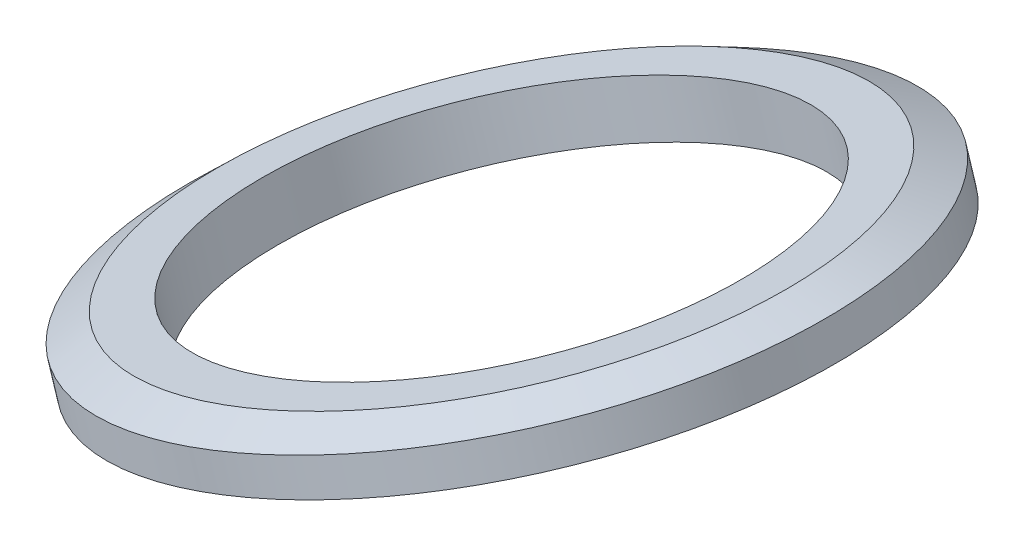
ISO-10303-21;
HEADER;
FILE_DESCRIPTION(('STEP AP214'),'2;1');
FILE_NAME('part.step','',(''),(''),'','','');
FILE_SCHEMA(('AUTOMOTIVE_DESIGN { 1 0 10303 214 1 1 1 1 }'));
ENDSEC;
DATA;
#1=APPLICATION_CONTEXT('core data for automotive mechanical design processes');
#2=APPLICATION_PROTOCOL_DEFINITION('international standard','automotive_design',2000,#1);
#3=PRODUCT_CONTEXT('',#1,'mechanical');
#4=PRODUCT('Part','Part','',(#3));
#5=PRODUCT_RELATED_PRODUCT_CATEGORY('part','',(#4));
#6=PRODUCT_DEFINITION_FORMATION('','',#4);
#7=PRODUCT_DEFINITION_CONTEXT('part definition',#1,'design');
#8=PRODUCT_DEFINITION('design','',#6,#7);
#9=PRODUCT_DEFINITION_SHAPE('','',#8);
#10=(LENGTH_UNIT() NAMED_UNIT(*) SI_UNIT(.MILLI.,.METRE.));
#11=(NAMED_UNIT(*) PLANE_ANGLE_UNIT() SI_UNIT($,.RADIAN.));
#12=(NAMED_UNIT(*) SI_UNIT($,.STERADIAN.) SOLID_ANGLE_UNIT());
#13=UNCERTAINTY_MEASURE_WITH_UNIT(LENGTH_MEASURE(1.E-05),#10,'distance_accuracy_value','');
#14=(GEOMETRIC_REPRESENTATION_CONTEXT(3) GLOBAL_UNCERTAINTY_ASSIGNED_CONTEXT((#13)) GLOBAL_UNIT_ASSIGNED_CONTEXT((#10,
#11,#12)) REPRESENTATION_CONTEXT('',''));
#15=CARTESIAN_POINT('',(0.,0.,0.));
#16=DIRECTION('',(0.,0.,1.));
#17=DIRECTION('',(1.,0.,0.));
#18=AXIS2_PLACEMENT_3D('',#15,#16,#17);
#19=CARTESIAN_POINT('',(406.994285309242,401.009715570309,0.));
#20=DIRECTION('',(-0.300714282645772,0.953714275982508,0.));
#21=DIRECTION('',(-0.953714275982508,-0.300714282645772,0.));
#22=AXIS2_PLACEMENT_3D('',#19,#20,#21);
#23=CYLINDRICAL_SURFACE('',#22,14.3);
#24=CARTESIAN_POINT('',(409.399999570408,393.380001362449,0.));
#25=DIRECTION('',(-0.300714282645772,0.953714275982508,0.));
#26=DIRECTION('',(-0.953714275982508,-0.300714282645772,0.));
#27=AXIS2_PLACEMENT_3D('',#24,#25,#26);
#28=CIRCLE('',#27,14.3000000000001);
#29=CARTESIAN_POINT('',(395.761885423858,389.079787120614,0.));
#30=VERTEX_POINT('',#29);
#31=EDGE_CURVE('E52',#30,#30,#28,.T.);
#32=ORIENTED_EDGE('',*,*,#31,.F.);
#33=EDGE_LOOP('',(#32));
#34=FACE_BOUND('',#33,.T.);
#35=CARTESIAN_POINT('',(408.497856722471,396.241144190396,0.));
#36=DIRECTION('',(-0.300714282645772,0.953714275982508,0.));
#37=DIRECTION('',(-0.953714275982508,-0.300714282645772,0.));
#38=AXIS2_PLACEMENT_3D('',#35,#36,#37);
#39=CIRCLE('',#38,14.3);
#40=CARTESIAN_POINT('',(394.859742575921,391.940929948562,0.));
#41=VERTEX_POINT('',#40);
#42=EDGE_CURVE('E10',#41,#41,#39,.T.);
#43=ORIENTED_EDGE('',*,*,#42,.T.);
#44=EDGE_LOOP('',(#43));
#45=FACE_BOUND('',#44,.T.);
#46=ADVANCED_FACE('F33',(#34,#45),#23,.F.);
#47=CARTESIAN_POINT('',(422.135970869021,400.541358432231,0.));
#48=DIRECTION('',(0.300714282645772,-0.953714275982508,0.));
#49=DIRECTION('',(0.953714275982508,0.300714282645772,0.));
#50=AXIS2_PLACEMENT_3D('',#47,#48,#49);
#51=PLANE('',#50);
#52=ORIENTED_EDGE('',*,*,#42,.F.);
#53=EDGE_LOOP('',(#52));
#54=FACE_BOUND('',#53,.T.);
#55=CARTESIAN_POINT('',(408.497856722471,396.241144190396,0.));
#56=DIRECTION('',(-0.300714282645772,0.953714275982508,0.));
#57=DIRECTION('',(-0.953714275982508,-0.300714282645772,0.));
#58=AXIS2_PLACEMENT_3D('',#55,#56,#57);
#59=CIRCLE('',#58,17.);
#60=CARTESIAN_POINT('',(392.284714030768,391.129001385418,0.));
#61=VERTEX_POINT('',#60);
#62=EDGE_CURVE('E39',#61,#61,#59,.T.);
#63=ORIENTED_EDGE('',*,*,#62,.T.);
#64=EDGE_LOOP('',(#63));
#65=FACE_BOUND('',#64,.T.);
#66=ADVANCED_FACE('F59',(#54,#65),#51,.F.);
#67=CARTESIAN_POINT('',(408.798571005117,395.287429914414,0.));
#68=DIRECTION('',(0.300714282645772,-0.953714275982508,0.));
#69=DIRECTION('',(0.953714275982508,0.300714282645772,0.));
#70=AXIS2_PLACEMENT_3D('',#67,#68,#69);
#71=CONICAL_SURFACE('',#70,19.,1.1071487177941);
#72=ORIENTED_EDGE('',*,*,#62,.F.);
#73=EDGE_LOOP('',(#72));
#74=FACE_BOUND('',#73,.T.);
#75=CARTESIAN_POINT('',(408.798571005117,395.287429914414,0.));
#76=DIRECTION('',(-0.300714282645772,0.953714275982508,0.));
#77=DIRECTION('',(-0.953714275982508,-0.300714282645772,0.));
#78=AXIS2_PLACEMENT_3D('',#75,#76,#77);
#79=CIRCLE('',#78,19.);
#80=CARTESIAN_POINT('',(390.677999761449,389.573858544144,0.));
#81=VERTEX_POINT('',#80);
#82=EDGE_CURVE('E43',#81,#81,#79,.T.);
#83=ORIENTED_EDGE('',*,*,#82,.T.);
#84=EDGE_LOOP('',(#83));
#85=FACE_BOUND('',#84,.T.);
#86=ADVANCED_FACE('F63',(#74,#85),#71,.T.);
#87=CARTESIAN_POINT('',(406.994285309242,401.009715570309,0.));
#88=DIRECTION('',(-0.300714282645772,0.953714275982508,0.));
#89=DIRECTION('',(-0.953714275982508,-0.300714282645772,0.));
#90=AXIS2_PLACEMENT_3D('',#87,#88,#89);
#91=CYLINDRICAL_SURFACE('',#90,19.0000000000001);
#92=ORIENTED_EDGE('',*,*,#82,.F.);
#93=EDGE_LOOP('',(#92));
#94=FACE_BOUND('',#93,.T.);
#95=CARTESIAN_POINT('',(409.399999570408,393.380001362449,0.));
#96=DIRECTION('',(-0.300714282645772,0.953714275982508,0.));
#97=DIRECTION('',(-0.953714275982508,-0.300714282645772,0.));
#98=AXIS2_PLACEMENT_3D('',#95,#96,#97);
#99=CIRCLE('',#98,19.0000000000001);
#100=CARTESIAN_POINT('',(391.27942832674,387.666429992179,0.));
#101=VERTEX_POINT('',#100);
#102=EDGE_CURVE('E47',#101,#101,#99,.T.);
#103=ORIENTED_EDGE('',*,*,#102,.T.);
#104=EDGE_LOOP('',(#103));
#105=FACE_BOUND('',#104,.T.);
#106=ADVANCED_FACE('F68',(#94,#105),#91,.T.);
#107=CARTESIAN_POINT('',(427.520570814076,399.093572732719,0.));
#108=DIRECTION('',(-0.300714282645772,0.953714275982508,0.));
#109=DIRECTION('',(-0.953714275982508,-0.300714282645772,0.));
#110=AXIS2_PLACEMENT_3D('',#107,#108,#109);
#111=PLANE('',#110);
#112=ORIENTED_EDGE('',*,*,#102,.F.);
#113=EDGE_LOOP('',(#112));
#114=FACE_BOUND('',#113,.T.);
#115=ORIENTED_EDGE('',*,*,#31,.T.);
#116=EDGE_LOOP('',(#115));
#117=FACE_BOUND('',#116,.T.);
#118=ADVANCED_FACE('F56',(#114,#117),#111,.F.);
#119=CLOSED_SHELL('',(#46,#66,#86,#106,#118));
#120=MANIFOLD_SOLID_BREP('B2',#119);
#121=ADVANCED_BREP_SHAPE_REPRESENTATION('',(#18,#120),#14);
#122=SHAPE_DEFINITION_REPRESENTATION(#9,#121);
ENDSEC;
END-ISO-10303-21;
